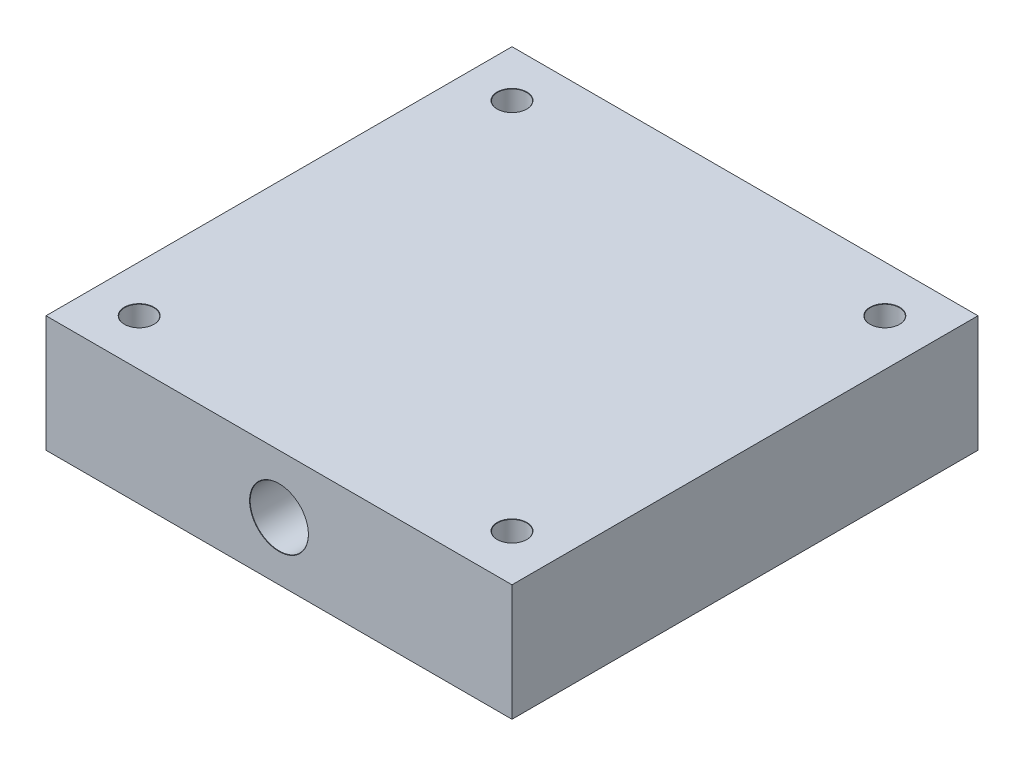
ISO-10303-21;
HEADER;
FILE_DESCRIPTION(('STEP AP214'),'2;1');
FILE_NAME('part.step','',(''),(''),'','','');
FILE_SCHEMA(('AUTOMOTIVE_DESIGN { 1 0 10303 214 1 1 1 1 }'));
ENDSEC;
DATA;
#1=APPLICATION_CONTEXT('core data for automotive mechanical design processes');
#2=APPLICATION_PROTOCOL_DEFINITION('international standard','automotive_design',2000,#1);
#3=PRODUCT_CONTEXT('',#1,'mechanical');
#4=PRODUCT('Part','Part','',(#3));
#5=PRODUCT_RELATED_PRODUCT_CATEGORY('part','',(#4));
#6=PRODUCT_DEFINITION_FORMATION('','',#4);
#7=PRODUCT_DEFINITION_CONTEXT('part definition',#1,'design');
#8=PRODUCT_DEFINITION('design','',#6,#7);
#9=PRODUCT_DEFINITION_SHAPE('','',#8);
#10=(LENGTH_UNIT() NAMED_UNIT(*) SI_UNIT(.MILLI.,.METRE.));
#11=(NAMED_UNIT(*) PLANE_ANGLE_UNIT() SI_UNIT($,.RADIAN.));
#12=(NAMED_UNIT(*) SI_UNIT($,.STERADIAN.) SOLID_ANGLE_UNIT());
#13=UNCERTAINTY_MEASURE_WITH_UNIT(LENGTH_MEASURE(1.E-05),#10,'distance_accuracy_value','');
#14=(GEOMETRIC_REPRESENTATION_CONTEXT(3) GLOBAL_UNCERTAINTY_ASSIGNED_CONTEXT((#13)) GLOBAL_UNIT_ASSIGNED_CONTEXT((#10,
#11,#12)) REPRESENTATION_CONTEXT('',''));
#15=CARTESIAN_POINT('',(0.,0.,0.));
#16=DIRECTION('',(0.,0.,1.));
#17=DIRECTION('',(1.,0.,0.));
#18=AXIS2_PLACEMENT_3D('',#15,#16,#17);
#19=CARTESIAN_POINT('',(0.,10.,0.));
#20=DIRECTION('',(1.,0.,0.));
#21=DIRECTION('',(0.,0.,-1.));
#22=AXIS2_PLACEMENT_3D('',#19,#20,#21);
#23=PLANE('',#22);
#24=DIRECTION('',(0.,0.,1.));
#25=VECTOR('',#24,1.);
#26=CARTESIAN_POINT('',(0.,0.,0.));
#27=LINE('',#26,#25);
#28=CARTESIAN_POINT('',(0.,0.,-40.));
#29=VERTEX_POINT('',#28);
#30=CARTESIAN_POINT('',(0.,0.,0.));
#31=VERTEX_POINT('',#30);
#32=EDGE_CURVE('E102',#29,#31,#27,.T.);
#33=ORIENTED_EDGE('',*,*,#32,.T.);
#34=DIRECTION('',(0.,-1.,0.));
#35=VECTOR('',#34,1.);
#36=CARTESIAN_POINT('',(0.,10.,0.));
#37=LINE('',#36,#35);
#38=CARTESIAN_POINT('',(0.,10.,0.));
#39=VERTEX_POINT('',#38);
#40=EDGE_CURVE('E11',#39,#31,#37,.T.);
#41=ORIENTED_EDGE('',*,*,#40,.F.);
#42=DIRECTION('',(0.,0.,1.));
#43=VECTOR('',#42,1.);
#44=CARTESIAN_POINT('',(0.,10.,0.));
#45=LINE('',#44,#43);
#46=CARTESIAN_POINT('',(0.,10.,-40.));
#47=VERTEX_POINT('',#46);
#48=EDGE_CURVE('E89',#47,#39,#45,.T.);
#49=ORIENTED_EDGE('',*,*,#48,.F.);
#50=DIRECTION('',(0.,-1.,0.));
#51=VECTOR('',#50,1.);
#52=CARTESIAN_POINT('',(0.,10.,-40.));
#53=LINE('',#52,#51);
#54=EDGE_CURVE('E98',#47,#29,#53,.T.);
#55=ORIENTED_EDGE('',*,*,#54,.T.);
#56=EDGE_LOOP('',(#33,#41,#49,#55));
#57=FACE_BOUND('',#56,.T.);
#58=ADVANCED_FACE('F32',(#57),#23,.F.);
#59=CARTESIAN_POINT('',(0.,10.,0.));
#60=DIRECTION('',(0.,0.,-1.));
#61=DIRECTION('',(-1.,0.,0.));
#62=AXIS2_PLACEMENT_3D('',#59,#60,#61);
#63=PLANE('',#62);
#64=CARTESIAN_POINT('',(20.,5.,0.));
#65=DIRECTION('',(0.,0.,1.));
#66=DIRECTION('',(1.,0.,0.));
#67=AXIS2_PLACEMENT_3D('',#64,#65,#66);
#68=CIRCLE('',#67,2.525);
#69=CARTESIAN_POINT('',(22.525,5.,0.));
#70=VERTEX_POINT('',#69);
#71=EDGE_CURVE('E115',#70,#70,#68,.T.);
#72=ORIENTED_EDGE('',*,*,#71,.F.);
#73=EDGE_LOOP('',(#72));
#74=FACE_BOUND('',#73,.T.);
#75=DIRECTION('',(1.,0.,0.));
#76=VECTOR('',#75,1.);
#77=CARTESIAN_POINT('',(0.,0.,0.));
#78=LINE('',#77,#76);
#79=CARTESIAN_POINT('',(40.,0.,0.));
#80=VERTEX_POINT('',#79);
#81=EDGE_CURVE('E93',#31,#80,#78,.T.);
#82=ORIENTED_EDGE('',*,*,#81,.T.);
#83=DIRECTION('',(0.,-1.,0.));
#84=VECTOR('',#83,1.);
#85=CARTESIAN_POINT('',(40.,10.,0.));
#86=LINE('',#85,#84);
#87=CARTESIAN_POINT('',(40.,10.,0.));
#88=VERTEX_POINT('',#87);
#89=EDGE_CURVE('E45',#88,#80,#86,.T.);
#90=ORIENTED_EDGE('',*,*,#89,.F.);
#91=DIRECTION('',(1.,0.,0.));
#92=VECTOR('',#91,1.);
#93=CARTESIAN_POINT('',(0.,10.,0.));
#94=LINE('',#93,#92);
#95=EDGE_CURVE('E84',#39,#88,#94,.T.);
#96=ORIENTED_EDGE('',*,*,#95,.F.);
#97=ORIENTED_EDGE('',*,*,#40,.T.);
#98=EDGE_LOOP('',(#82,#90,#96,#97));
#99=FACE_BOUND('',#98,.T.);
#100=ADVANCED_FACE('F92',(#74,#99),#63,.F.);
#101=CARTESIAN_POINT('',(40.,10.,0.));
#102=DIRECTION('',(-1.,0.,0.));
#103=DIRECTION('',(0.,0.,1.));
#104=AXIS2_PLACEMENT_3D('',#101,#102,#103);
#105=PLANE('',#104);
#106=DIRECTION('',(0.,0.,-1.));
#107=VECTOR('',#106,1.);
#108=CARTESIAN_POINT('',(40.,0.,0.));
#109=LINE('',#108,#107);
#110=CARTESIAN_POINT('',(40.,0.,-40.));
#111=VERTEX_POINT('',#110);
#112=EDGE_CURVE('E71',#80,#111,#109,.T.);
#113=ORIENTED_EDGE('',*,*,#112,.T.);
#114=DIRECTION('',(0.,-1.,0.));
#115=VECTOR('',#114,1.);
#116=CARTESIAN_POINT('',(40.,10.,-40.));
#117=LINE('',#116,#115);
#118=CARTESIAN_POINT('',(40.,10.,-40.));
#119=VERTEX_POINT('',#118);
#120=EDGE_CURVE('E94',#119,#111,#117,.T.);
#121=ORIENTED_EDGE('',*,*,#120,.F.);
#122=DIRECTION('',(0.,0.,-1.));
#123=VECTOR('',#122,1.);
#124=CARTESIAN_POINT('',(40.,10.,0.));
#125=LINE('',#124,#123);
#126=EDGE_CURVE('E87',#88,#119,#125,.T.);
#127=ORIENTED_EDGE('',*,*,#126,.F.);
#128=ORIENTED_EDGE('',*,*,#89,.T.);
#129=EDGE_LOOP('',(#113,#121,#127,#128));
#130=FACE_BOUND('',#129,.T.);
#131=ADVANCED_FACE('F96',(#130),#105,.F.);
#132=CARTESIAN_POINT('',(0.,10.,-40.));
#133=DIRECTION('',(0.,0.,1.));
#134=DIRECTION('',(1.,0.,0.));
#135=AXIS2_PLACEMENT_3D('',#132,#133,#134);
#136=PLANE('',#135);
#137=CARTESIAN_POINT('',(20.,5.,-40.));
#138=DIRECTION('',(0.,0.,-1.));
#139=DIRECTION('',(-1.,0.,0.));
#140=AXIS2_PLACEMENT_3D('',#137,#138,#139);
#141=CIRCLE('',#140,3.);
#142=CARTESIAN_POINT('',(17.,5.,-40.));
#143=VERTEX_POINT('',#142);
#144=EDGE_CURVE('E123',#143,#143,#141,.T.);
#145=ORIENTED_EDGE('',*,*,#144,.F.);
#146=EDGE_LOOP('',(#145));
#147=FACE_BOUND('',#146,.T.);
#148=DIRECTION('',(-1.,0.,0.));
#149=VECTOR('',#148,1.);
#150=CARTESIAN_POINT('',(0.,0.,-40.));
#151=LINE('',#150,#149);
#152=EDGE_CURVE('E77',#111,#29,#151,.T.);
#153=ORIENTED_EDGE('',*,*,#152,.T.);
#154=ORIENTED_EDGE('',*,*,#54,.F.);
#155=DIRECTION('',(-1.,0.,0.));
#156=VECTOR('',#155,1.);
#157=CARTESIAN_POINT('',(0.,10.,-40.));
#158=LINE('',#157,#156);
#159=EDGE_CURVE('E54',#119,#47,#158,.T.);
#160=ORIENTED_EDGE('',*,*,#159,.F.);
#161=ORIENTED_EDGE('',*,*,#120,.T.);
#162=EDGE_LOOP('',(#153,#154,#160,#161));
#163=FACE_BOUND('',#162,.T.);
#164=ADVANCED_FACE('F159',(#147,#163),#136,.F.);
#165=CARTESIAN_POINT('',(0.,10.,0.));
#166=DIRECTION('',(0.,-1.,0.));
#167=DIRECTION('',(0.,0.,-1.));
#168=AXIS2_PLACEMENT_3D('',#165,#166,#167);
#169=PLANE('',#168);
#170=CARTESIAN_POINT('',(4.,10.,-4.));
#171=DIRECTION('',(0.,-1.,0.));
#172=DIRECTION('',(0.,0.,-1.));
#173=AXIS2_PLACEMENT_3D('',#170,#171,#172);
#174=CIRCLE('',#173,1.275);
#175=CARTESIAN_POINT('',(4.,10.,-5.27499999999999));
#176=VERTEX_POINT('',#175);
#177=EDGE_CURVE('E252',#176,#176,#174,.T.);
#178=ORIENTED_EDGE('',*,*,#177,.T.);
#179=EDGE_LOOP('',(#178));
#180=FACE_BOUND('',#179,.T.);
#181=CARTESIAN_POINT('',(36.,10.,-4.));
#182=DIRECTION('',(0.,-1.,0.));
#183=DIRECTION('',(0.,0.,-1.));
#184=AXIS2_PLACEMENT_3D('',#181,#182,#183);
#185=CIRCLE('',#184,1.275);
#186=CARTESIAN_POINT('',(36.,10.,-5.275));
#187=VERTEX_POINT('',#186);
#188=EDGE_CURVE('E264',#187,#187,#185,.T.);
#189=ORIENTED_EDGE('',*,*,#188,.T.);
#190=EDGE_LOOP('',(#189));
#191=FACE_BOUND('',#190,.T.);
#192=CARTESIAN_POINT('',(36.,10.,-36.));
#193=DIRECTION('',(0.,-1.,0.));
#194=DIRECTION('',(0.,0.,-1.));
#195=AXIS2_PLACEMENT_3D('',#192,#193,#194);
#196=CIRCLE('',#195,1.275);
#197=CARTESIAN_POINT('',(36.,10.,-37.275));
#198=VERTEX_POINT('',#197);
#199=EDGE_CURVE('E276',#198,#198,#196,.T.);
#200=ORIENTED_EDGE('',*,*,#199,.T.);
#201=EDGE_LOOP('',(#200));
#202=FACE_BOUND('',#201,.T.);
#203=CARTESIAN_POINT('',(4.,10.,-36.));
#204=DIRECTION('',(0.,-1.,0.));
#205=DIRECTION('',(0.,0.,-1.));
#206=AXIS2_PLACEMENT_3D('',#203,#204,#205);
#207=CIRCLE('',#206,1.275);
#208=CARTESIAN_POINT('',(4.,10.,-37.275));
#209=VERTEX_POINT('',#208);
#210=EDGE_CURVE('E288',#209,#209,#207,.T.);
#211=ORIENTED_EDGE('',*,*,#210,.T.);
#212=EDGE_LOOP('',(#211));
#213=FACE_BOUND('',#212,.T.);
#214=ORIENTED_EDGE('',*,*,#48,.T.);
#215=ORIENTED_EDGE('',*,*,#95,.T.);
#216=ORIENTED_EDGE('',*,*,#126,.T.);
#217=ORIENTED_EDGE('',*,*,#159,.T.);
#218=EDGE_LOOP('',(#214,#215,#216,#217));
#219=FACE_BOUND('',#218,.T.);
#220=ADVANCED_FACE('F85',(#180,#191,#202,#213,#219),#169,.F.);
#221=CARTESIAN_POINT('',(0.,0.,0.));
#222=DIRECTION('',(0.,-1.,0.));
#223=DIRECTION('',(0.,0.,-1.));
#224=AXIS2_PLACEMENT_3D('',#221,#222,#223);
#225=PLANE('',#224);
#226=CARTESIAN_POINT('',(20.,0.,-36.));
#227=DIRECTION('',(0.,-1.,0.));
#228=DIRECTION('',(0.,0.,-1.));
#229=AXIS2_PLACEMENT_3D('',#226,#227,#228);
#230=CIRCLE('',#229,1.275);
#231=CARTESIAN_POINT('',(20.,0.,-37.275));
#232=VERTEX_POINT('',#231);
#233=EDGE_CURVE('E248',#232,#232,#230,.T.);
#234=ORIENTED_EDGE('',*,*,#233,.F.);
#235=EDGE_LOOP('',(#234));
#236=FACE_BOUND('',#235,.T.);
#237=CARTESIAN_POINT('',(4.,0.,-4.));
#238=DIRECTION('',(0.,-1.,0.));
#239=DIRECTION('',(0.,0.,-1.));
#240=AXIS2_PLACEMENT_3D('',#237,#238,#239);
#241=CIRCLE('',#240,1.275);
#242=CARTESIAN_POINT('',(4.,0.,-5.275));
#243=VERTEX_POINT('',#242);
#244=EDGE_CURVE('E255',#243,#243,#241,.T.);
#245=ORIENTED_EDGE('',*,*,#244,.F.);
#246=EDGE_LOOP('',(#245));
#247=FACE_BOUND('',#246,.T.);
#248=CARTESIAN_POINT('',(36.,0.,-4.));
#249=DIRECTION('',(0.,-1.,0.));
#250=DIRECTION('',(0.,0.,-1.));
#251=AXIS2_PLACEMENT_3D('',#248,#249,#250);
#252=CIRCLE('',#251,1.275);
#253=CARTESIAN_POINT('',(36.,0.,-5.275));
#254=VERTEX_POINT('',#253);
#255=EDGE_CURVE('E267',#254,#254,#252,.T.);
#256=ORIENTED_EDGE('',*,*,#255,.F.);
#257=EDGE_LOOP('',(#256));
#258=FACE_BOUND('',#257,.T.);
#259=CARTESIAN_POINT('',(36.,0.,-36.));
#260=DIRECTION('',(0.,-1.,0.));
#261=DIRECTION('',(0.,0.,-1.));
#262=AXIS2_PLACEMENT_3D('',#259,#260,#261);
#263=CIRCLE('',#262,1.275);
#264=CARTESIAN_POINT('',(36.,0.,-37.275));
#265=VERTEX_POINT('',#264);
#266=EDGE_CURVE('E279',#265,#265,#263,.T.);
#267=ORIENTED_EDGE('',*,*,#266,.F.);
#268=EDGE_LOOP('',(#267));
#269=FACE_BOUND('',#268,.T.);
#270=CARTESIAN_POINT('',(4.,0.,-36.));
#271=DIRECTION('',(0.,-1.,0.));
#272=DIRECTION('',(0.,0.,-1.));
#273=AXIS2_PLACEMENT_3D('',#270,#271,#272);
#274=CIRCLE('',#273,1.275);
#275=CARTESIAN_POINT('',(4.,0.,-37.275));
#276=VERTEX_POINT('',#275);
#277=EDGE_CURVE('E291',#276,#276,#274,.T.);
#278=ORIENTED_EDGE('',*,*,#277,.F.);
#279=EDGE_LOOP('',(#278));
#280=FACE_BOUND('',#279,.T.);
#281=ORIENTED_EDGE('',*,*,#32,.F.);
#282=ORIENTED_EDGE('',*,*,#152,.F.);
#283=ORIENTED_EDGE('',*,*,#112,.F.);
#284=ORIENTED_EDGE('',*,*,#81,.F.);
#285=EDGE_LOOP('',(#281,#282,#283,#284));
#286=FACE_BOUND('',#285,.T.);
#287=ADVANCED_FACE('F167',(#236,#247,#258,#269,#280,#286),#225,.T.);
#288=CARTESIAN_POINT('',(20.,5.,0.));
#289=DIRECTION('',(0.,0.,1.));
#290=DIRECTION('',(1.,0.,0.));
#291=AXIS2_PLACEMENT_3D('',#288,#289,#290);
#292=CYLINDRICAL_SURFACE('',#291,1.99999999999999);
#293=CARTESIAN_POINT('',(20.,5.,-19.3991393809724));
#294=DIRECTION('',(0.,0.,-1.));
#295=DIRECTION('',(-1.,0.,0.));
#296=AXIS2_PLACEMENT_3D('',#293,#294,#295);
#297=CIRCLE('',#296,1.99999999999999);
#298=CARTESIAN_POINT('',(18.,5.,-19.3991393809724));
#299=VERTEX_POINT('',#298);
#300=EDGE_CURVE('E113',#299,#299,#297,.T.);
#301=ORIENTED_EDGE('',*,*,#300,.T.);
#302=EDGE_LOOP('',(#301));
#303=FACE_BOUND('',#302,.T.);
#304=CARTESIAN_POINT('',(20.,5.,-8.30043030951378));
#305=DIRECTION('',(0.,0.,1.));
#306=DIRECTION('',(1.,0.,0.));
#307=AXIS2_PLACEMENT_3D('',#304,#305,#306);
#308=CIRCLE('',#307,1.99999999999999);
#309=CARTESIAN_POINT('',(22.,5.,-8.30043030951378));
#310=VERTEX_POINT('',#309);
#311=EDGE_CURVE('E105',#310,#310,#308,.T.);
#312=ORIENTED_EDGE('',*,*,#311,.T.);
#313=EDGE_LOOP('',(#312));
#314=FACE_BOUND('',#313,.T.);
#315=ADVANCED_FACE('F170',(#303,#314),#292,.F.);
#316=CARTESIAN_POINT('',(20.,5.,-7.99999999999999));
#317=DIRECTION('',(0.,0.,1.));
#318=DIRECTION('',(1.,0.,0.));
#319=AXIS2_PLACEMENT_3D('',#316,#317,#318);
#320=CONICAL_SURFACE('',#319,2.49999999999999,1.02974425867665);
#321=CARTESIAN_POINT('',(20.,5.,-7.99999999999999));
#322=DIRECTION('',(0.,0.,1.));
#323=DIRECTION('',(1.,0.,0.));
#324=AXIS2_PLACEMENT_3D('',#321,#322,#323);
#325=CIRCLE('',#324,2.49999999999999);
#326=CARTESIAN_POINT('',(22.5,5.,-7.99999999999999));
#327=VERTEX_POINT('',#326);
#328=EDGE_CURVE('E112',#327,#327,#325,.T.);
#329=ORIENTED_EDGE('',*,*,#328,.T.);
#330=EDGE_LOOP('',(#329));
#331=FACE_BOUND('',#330,.T.);
#332=ORIENTED_EDGE('',*,*,#311,.F.);
#333=EDGE_LOOP('',(#332));
#334=FACE_BOUND('',#333,.T.);
#335=ADVANCED_FACE('F137',(#331,#334),#320,.F.);
#336=CARTESIAN_POINT('',(20.,5.,0.));
#337=DIRECTION('',(0.,0.,1.));
#338=DIRECTION('',(1.,0.,0.));
#339=AXIS2_PLACEMENT_3D('',#336,#337,#338);
#340=CYLINDRICAL_SURFACE('',#339,2.49999999999999);
#341=ORIENTED_EDGE('',*,*,#328,.F.);
#342=EDGE_LOOP('',(#341));
#343=FACE_BOUND('',#342,.T.);
#344=CARTESIAN_POINT('',(20.,5.,-0.0250000000000007));
#345=DIRECTION('',(0.,0.,1.));
#346=DIRECTION('',(1.,0.,0.));
#347=AXIS2_PLACEMENT_3D('',#344,#345,#346);
#348=CIRCLE('',#347,2.5);
#349=CARTESIAN_POINT('',(22.5,5.,-0.0250000000000007));
#350=VERTEX_POINT('',#349);
#351=EDGE_CURVE('E120',#350,#350,#348,.T.);
#352=ORIENTED_EDGE('',*,*,#351,.T.);
#353=EDGE_LOOP('',(#352));
#354=FACE_BOUND('',#353,.T.);
#355=ADVANCED_FACE('F140',(#343,#354),#340,.F.);
#356=CARTESIAN_POINT('',(20.,5.,0.));
#357=DIRECTION('',(0.,0.,1.));
#358=DIRECTION('',(1.,0.,0.));
#359=AXIS2_PLACEMENT_3D('',#356,#357,#358);
#360=CONICAL_SURFACE('',#359,2.525,0.785398163397414);
#361=ORIENTED_EDGE('',*,*,#351,.F.);
#362=EDGE_LOOP('',(#361));
#363=FACE_BOUND('',#362,.T.);
#364=ORIENTED_EDGE('',*,*,#71,.T.);
#365=EDGE_LOOP('',(#364));
#366=FACE_BOUND('',#365,.T.);
#367=ADVANCED_FACE('F143',(#363,#366),#360,.F.);
#368=CARTESIAN_POINT('',(20.,5.,-20.));
#369=DIRECTION('',(0.,0.,-1.));
#370=DIRECTION('',(-1.,0.,0.));
#371=AXIS2_PLACEMENT_3D('',#368,#369,#370);
#372=CONICAL_SURFACE('',#371,3.,1.02974425867665);
#373=CARTESIAN_POINT('',(20.,5.,-20.));
#374=DIRECTION('',(0.,0.,-1.));
#375=DIRECTION('',(-1.,0.,0.));
#376=AXIS2_PLACEMENT_3D('',#373,#374,#375);
#377=CIRCLE('',#376,3.);
#378=CARTESIAN_POINT('',(17.,5.,-20.));
#379=VERTEX_POINT('',#378);
#380=EDGE_CURVE('E116',#379,#379,#377,.T.);
#381=ORIENTED_EDGE('',*,*,#380,.T.);
#382=EDGE_LOOP('',(#381));
#383=FACE_BOUND('',#382,.T.);
#384=ORIENTED_EDGE('',*,*,#300,.F.);
#385=EDGE_LOOP('',(#384));
#386=FACE_BOUND('',#385,.T.);
#387=ADVANCED_FACE('F149',(#383,#386),#372,.F.);
#388=CARTESIAN_POINT('',(20.,5.,-40.));
#389=DIRECTION('',(0.,0.,-1.));
#390=DIRECTION('',(-1.,0.,0.));
#391=AXIS2_PLACEMENT_3D('',#388,#389,#390);
#392=CYLINDRICAL_SURFACE('',#391,3.);
#393=CARTESIAN_POINT('',(20.,2.,-37.25));
#394=CARTESIAN_POINT('',(20.0669580526363,2.00000541632728,-37.2499927949087));
#395=CARTESIAN_POINT('',(20.1340213970638,2.0022676702529,-37.2445880414719));
#396=CARTESIAN_POINT('',(20.2662473711563,2.01109846420449,-37.2231609350798));
#397=CARTESIAN_POINT('',(20.3314045764236,2.01767824098973,-37.2071108755357));
#398=CARTESIAN_POINT('',(20.4576887336531,2.03443710961873,-37.1650889082194));
#399=CARTESIAN_POINT('',(20.5188285244263,2.04460400024997,-37.1391506105318));
#400=CARTESIAN_POINT('',(20.6358297566798,2.06754713529336,-37.0782271767674));
#401=CARTESIAN_POINT('',(20.6916927900159,2.08032258907151,-37.0432447810291));
#402=CARTESIAN_POINT('',(20.7994484035595,2.10792171648132,-36.9633710174091));
#403=CARTESIAN_POINT('',(20.8510412675178,2.12281246673908,-36.9180986912102));
#404=CARTESIAN_POINT('',(20.9461598210913,2.15267285931487,-36.8197356652174));
#405=CARTESIAN_POINT('',(20.9896812631531,2.16764253893191,-36.7666408751055));
#406=CARTESIAN_POINT('',(21.0695373769707,2.19678978187005,-36.6509732224351));
#407=CARTESIAN_POINT('',(21.1054130815393,2.21089213126616,-36.5880625515735));
#408=CARTESIAN_POINT('',(21.1659394058887,2.23564427642995,-36.4564267420791));
#409=CARTESIAN_POINT('',(21.1905958083629,2.24629584999177,-36.3877046205155));
#410=CARTESIAN_POINT('',(21.2267459831216,2.26221444612295,-36.2498463082321));
#411=CARTESIAN_POINT('',(21.2388165787761,2.26771612348213,-36.1808895166079));
#412=CARTESIAN_POINT('',(21.251252099678,2.27338673780496,-36.0417267073134));
#413=CARTESIAN_POINT('',(21.251623480544,2.27355861574741,-35.9715213999743));
#414=CARTESIAN_POINT('',(21.2410845036367,2.26874880439148,-35.8375999395651));
#415=CARTESIAN_POINT('',(21.231036811123,2.26416117276378,-35.7737989034355));
#416=CARTESIAN_POINT('',(21.2013919101578,2.25101517226204,-35.6488879089996));
#417=CARTESIAN_POINT('',(21.1817928728718,2.24245604296437,-35.5877784685082));
#418=CARTESIAN_POINT('',(21.1332195872757,2.22213815227244,-35.4684422970086));
#419=CARTESIAN_POINT('',(21.1040547153924,2.21031518050864,-35.4103045790866));
#420=CARTESIAN_POINT('',(21.0373124258056,2.18481668858914,-35.2995222661199));
#421=CARTESIAN_POINT('',(20.9997316905195,2.17114043870221,-35.2468798493865));
#422=CARTESIAN_POINT('',(20.9134959655438,2.14207023122021,-35.1439000412672));
#423=CARTESIAN_POINT('',(20.8641734832075,2.12662878595528,-35.0941334326146));
#424=CARTESIAN_POINT('',(20.7577295910515,2.09674326887471,-35.0033864970408));
#425=CARTESIAN_POINT('',(20.7006063594485,2.0822994312299,-34.9624082283078));
#426=CARTESIAN_POINT('',(20.5784479486934,2.05561716443527,-34.8895641763837));
#427=CARTESIAN_POINT('',(20.5132605824477,2.04343733456667,-34.8579305548493));
#428=CARTESIAN_POINT('',(20.3778524025268,2.02310518585197,-34.8062788603968));
#429=CARTESIAN_POINT('',(20.307634394795,2.014950641542,-34.7862543680562));
#430=CARTESIAN_POINT('',(20.1689281133462,2.00400358813615,-34.7595840078734));
#431=CARTESIAN_POINT('',(20.1006112852786,2.00090458952875,-34.7521721425563));
#432=CARTESIAN_POINT('',(19.9636453445039,1.99943949631256,-34.7486537763859));
#433=CARTESIAN_POINT('',(19.8949963328474,2.00107204288061,-34.752544029748));
#434=CARTESIAN_POINT('',(19.7629017576586,2.0086878234306,-34.7709710848061));
#435=CARTESIAN_POINT('',(19.6993670333606,2.01445112716011,-34.7849699540972));
#436=CARTESIAN_POINT('',(19.5756172510289,2.02951393227586,-34.8224681945408));
#437=CARTESIAN_POINT('',(19.5154026134816,2.03881388040297,-34.8459687659503));
#438=CARTESIAN_POINT('',(19.3978910001309,2.06041729354835,-34.9025709757121));
#439=CARTESIAN_POINT('',(19.3407427631447,2.07280508530719,-34.935948183146));
#440=CARTESIAN_POINT('',(19.2326537837686,2.0992619542091,-35.0110533777917));
#441=CARTESIAN_POINT('',(19.1817156473981,2.11333173231267,-35.0527848515293));
#442=CARTESIAN_POINT('',(19.0836665697257,2.14287912104563,-35.1469032332724));
#443=CARTESIAN_POINT('',(19.0370893020202,2.15838548408971,-35.1998385029863));
#444=CARTESIAN_POINT('',(18.9533301538945,2.18815663231995,-35.3130212759354));
#445=CARTESIAN_POINT('',(18.9161504071438,2.20242113506562,-35.3732704351717));
#446=CARTESIAN_POINT('',(18.851840397913,2.22818613756012,-35.5006141753026));
#447=CARTESIAN_POINT('',(18.8248608176267,2.23964437444889,-35.5677940355148));
#448=CARTESIAN_POINT('',(18.7828258604843,2.25791644341043,-35.7063705938101));
#449=CARTESIAN_POINT('',(18.7677606513631,2.26473410444248,-35.7777637624834));
#450=CARTESIAN_POINT('',(18.750959196511,2.27236835462736,-35.9168186991992));
#451=CARTESIAN_POINT('',(18.7482861958687,2.27360649032838,-35.9843446622926));
#452=CARTESIAN_POINT('',(18.7538442447609,2.27106146988976,-36.1188428611411));
#453=CARTESIAN_POINT('',(18.7620736203528,2.26727908459694,-36.1858151803137));
#454=CARTESIAN_POINT('',(18.7884159521951,2.25550448697732,-36.3140927474689));
#455=CARTESIAN_POINT('',(18.8060509642853,2.2477164515352,-36.3755166734634));
#456=CARTESIAN_POINT('',(18.8502367179787,2.22896818800811,-36.4945480213572));
#457=CARTESIAN_POINT('',(18.8767899648275,2.21800706868307,-36.5521543653988));
#458=CARTESIAN_POINT('',(18.9398971406451,2.19333045439987,-36.6656958959491));
#459=CARTESIAN_POINT('',(18.9769563908952,2.17948897286321,-36.7213223301683));
#460=CARTESIAN_POINT('',(19.0593159273696,2.15096310946161,-36.8258601393607));
#461=CARTESIAN_POINT('',(19.1046190710944,2.13627843654125,-36.8747691756006));
#462=CARTESIAN_POINT('',(19.2060979542212,2.10643607149894,-36.9681486816848));
#463=CARTESIAN_POINT('',(19.262825260051,2.09132182488209,-37.0120364328407));
#464=CARTESIAN_POINT('',(19.3833999207468,2.0633985637798,-37.0896994535436));
#465=CARTESIAN_POINT('',(19.4472505020543,2.0505906008326,-37.1234701148896));
#466=CARTESIAN_POINT('',(19.5792679432821,2.02890816637539,-37.1792098454399));
#467=CARTESIAN_POINT('',(19.6473460090194,2.01997217418036,-37.2013647666173));
#468=CARTESIAN_POINT('',(19.7865895781534,2.00678990231376,-37.2337063290778));
#469=CARTESIAN_POINT('',(19.857744683019,2.00252894188034,-37.2439304425299));
#470=CARTESIAN_POINT('',(19.9527639180808,2.00027712431067,-37.2493331610865));
#471=CARTESIAN_POINT('',(19.9763754053243,1.99999808897465,-37.2500025421492));
#472=CARTESIAN_POINT('',(20.,2.,-37.25));
#473=B_SPLINE_CURVE_WITH_KNOTS('',3,(#393,#394,#395,#396,#397,#398,#399,#400,#401,#402,#403,
#404,#405,#406,#407,#408,#409,#410,#411,#412,#413,#414,#415,#416,#417,#418,#419,#420,#421,#422,
#423,#424,#425,#426,#427,#428,#429,#430,#431,#432,#433,#434,#435,#436,#437,#438,#439,#440,#441,
#442,#443,#444,#445,#446,#447,#448,#449,#450,#451,#452,#453,#454,#455,#456,#457,#458,#459,#460,
#461,#462,#463,#464,#465,#466,#467,#468,#469,#470,#471,#472),.UNSPECIFIED.,.T.,.F.,(4,2,2,2,2,2,
2,2,2,2,2,2,2,2,2,2,2,2,2,2,2,2,2,2,2,2,2,2,2,2,2,2,2,2,2,2,2,2,2,4),(0.,0.200806918883943,
0.402138540628699,0.602791851906306,0.80338443685298,1.01317936288808,1.22308438131466,
1.44331724539126,1.66343646730588,1.87295273137557,2.08235338249046,2.27570157202557,
2.46908679727213,2.66658713058714,2.86416545717206,3.07844141127896,3.29276749314588,
3.51204055060813,3.73119224218297,3.9364844339325,4.14171767493171,4.33676589735721,
4.53183876601785,4.73297135272161,4.93418805469496,5.14978488029294,5.3654306124034,
5.58414788359522,5.8026844707458,6.00439877559643,6.20608211297536,6.39837649964761,
6.59072494950612,6.79463893397441,6.99862373425944,7.21746535004889,7.43640649428583,
7.65172855819385,7.86637250469321,7.93722256499097),.UNSPECIFIED.);
#474=CARTESIAN_POINT('',(20.,2.,-37.25));
#475=VERTEX_POINT('',#474);
#476=EDGE_CURVE('E35',#475,#475,#473,.T.);
#477=ORIENTED_EDGE('',*,*,#476,.T.);
#478=EDGE_LOOP('',(#477));
#479=FACE_BOUND('',#478,.T.);
#480=ORIENTED_EDGE('',*,*,#380,.F.);
#481=EDGE_LOOP('',(#480));
#482=FACE_BOUND('',#481,.T.);
#483=ORIENTED_EDGE('',*,*,#144,.T.);
#484=EDGE_LOOP('',(#483));
#485=FACE_BOUND('',#484,.T.);
#486=ADVANCED_FACE('F180',(#479,#482,#485),#392,.F.);
#487=CARTESIAN_POINT('',(4.,9.975,-36.));
#488=DIRECTION('',(0.,1.,0.));
#489=DIRECTION('',(0.,0.,1.));
#490=AXIS2_PLACEMENT_3D('',#487,#488,#489);
#491=CONICAL_SURFACE('',#490,1.25,0.785398163397483);
#492=ORIENTED_EDGE('',*,*,#210,.F.);
#493=EDGE_LOOP('',(#492));
#494=FACE_BOUND('',#493,.T.);
#495=CARTESIAN_POINT('',(4.,9.975,-36.));
#496=DIRECTION('',(0.,-1.,0.));
#497=DIRECTION('',(0.,0.,-1.));
#498=AXIS2_PLACEMENT_3D('',#495,#496,#497);
#499=CIRCLE('',#498,1.25);
#500=CARTESIAN_POINT('',(4.,9.975,-37.25));
#501=VERTEX_POINT('',#500);
#502=EDGE_CURVE('E128',#501,#501,#499,.T.);
#503=ORIENTED_EDGE('',*,*,#502,.T.);
#504=EDGE_LOOP('',(#503));
#505=FACE_BOUND('',#504,.T.);
#506=ADVANCED_FACE('F184',(#494,#505),#491,.F.);
#507=CARTESIAN_POINT('',(4.,0.,-36.));
#508=DIRECTION('',(0.,-1.,0.));
#509=DIRECTION('',(0.,0.,-1.));
#510=AXIS2_PLACEMENT_3D('',#507,#508,#509);
#511=CYLINDRICAL_SURFACE('',#510,1.25);
#512=ORIENTED_EDGE('',*,*,#502,.F.);
#513=EDGE_LOOP('',(#512));
#514=FACE_BOUND('',#513,.T.);
#515=CARTESIAN_POINT('',(4.,0.0250000000000025,-36.));
#516=DIRECTION('',(0.,-1.,0.));
#517=DIRECTION('',(0.,0.,-1.));
#518=AXIS2_PLACEMENT_3D('',#515,#516,#517);
#519=CIRCLE('',#518,1.25);
#520=CARTESIAN_POINT('',(4.,0.0250000000000025,-37.25));
#521=VERTEX_POINT('',#520);
#522=EDGE_CURVE('E294',#521,#521,#519,.T.);
#523=ORIENTED_EDGE('',*,*,#522,.T.);
#524=EDGE_LOOP('',(#523));
#525=FACE_BOUND('',#524,.T.);
#526=ADVANCED_FACE('F188',(#514,#525),#511,.F.);
#527=CARTESIAN_POINT('',(4.,0.,-36.));
#528=DIRECTION('',(0.,-1.,0.));
#529=DIRECTION('',(0.,0.,-1.));
#530=AXIS2_PLACEMENT_3D('',#527,#528,#529);
#531=CONICAL_SURFACE('',#530,1.275,0.785398163397396);
#532=ORIENTED_EDGE('',*,*,#522,.F.);
#533=EDGE_LOOP('',(#532));
#534=FACE_BOUND('',#533,.T.);
#535=ORIENTED_EDGE('',*,*,#277,.T.);
#536=EDGE_LOOP('',(#535));
#537=FACE_BOUND('',#536,.T.);
#538=ADVANCED_FACE('F192',(#534,#537),#531,.F.);
#539=CARTESIAN_POINT('',(36.,9.975,-36.));
#540=DIRECTION('',(0.,1.,0.));
#541=DIRECTION('',(0.,0.,1.));
#542=AXIS2_PLACEMENT_3D('',#539,#540,#541);
#543=CONICAL_SURFACE('',#542,1.24999999999999,0.785398163397552);
#544=ORIENTED_EDGE('',*,*,#199,.F.);
#545=EDGE_LOOP('',(#544));
#546=FACE_BOUND('',#545,.T.);
#547=CARTESIAN_POINT('',(36.,9.975,-36.));
#548=DIRECTION('',(0.,-1.,0.));
#549=DIRECTION('',(0.,0.,-1.));
#550=AXIS2_PLACEMENT_3D('',#547,#548,#549);
#551=CIRCLE('',#550,1.24999999999999);
#552=CARTESIAN_POINT('',(36.,9.975,-37.25));
#553=VERTEX_POINT('',#552);
#554=EDGE_CURVE('E285',#553,#553,#551,.T.);
#555=ORIENTED_EDGE('',*,*,#554,.T.);
#556=EDGE_LOOP('',(#555));
#557=FACE_BOUND('',#556,.T.);
#558=ADVANCED_FACE('F196',(#546,#557),#543,.F.);
#559=CARTESIAN_POINT('',(36.,0.,-36.));
#560=DIRECTION('',(0.,-1.,0.));
#561=DIRECTION('',(0.,0.,-1.));
#562=AXIS2_PLACEMENT_3D('',#559,#560,#561);
#563=CYLINDRICAL_SURFACE('',#562,1.25);
#564=ORIENTED_EDGE('',*,*,#554,.F.);
#565=EDGE_LOOP('',(#564));
#566=FACE_BOUND('',#565,.T.);
#567=CARTESIAN_POINT('',(36.,0.0250000000000025,-36.));
#568=DIRECTION('',(0.,-1.,0.));
#569=DIRECTION('',(0.,0.,-1.));
#570=AXIS2_PLACEMENT_3D('',#567,#568,#569);
#571=CIRCLE('',#570,1.25);
#572=CARTESIAN_POINT('',(36.,0.0250000000000025,-37.25));
#573=VERTEX_POINT('',#572);
#574=EDGE_CURVE('E282',#573,#573,#571,.T.);
#575=ORIENTED_EDGE('',*,*,#574,.T.);
#576=EDGE_LOOP('',(#575));
#577=FACE_BOUND('',#576,.T.);
#578=ADVANCED_FACE('F200',(#566,#577),#563,.F.);
#579=CARTESIAN_POINT('',(36.,0.,-36.));
#580=DIRECTION('',(0.,-1.,0.));
#581=DIRECTION('',(0.,0.,-1.));
#582=AXIS2_PLACEMENT_3D('',#579,#580,#581);
#583=CONICAL_SURFACE('',#582,1.275,0.785398163397309);
#584=ORIENTED_EDGE('',*,*,#574,.F.);
#585=EDGE_LOOP('',(#584));
#586=FACE_BOUND('',#585,.T.);
#587=ORIENTED_EDGE('',*,*,#266,.T.);
#588=EDGE_LOOP('',(#587));
#589=FACE_BOUND('',#588,.T.);
#590=ADVANCED_FACE('F204',(#586,#589),#583,.F.);
#591=CARTESIAN_POINT('',(36.,9.975,-4.));
#592=DIRECTION('',(0.,1.,0.));
#593=DIRECTION('',(0.,0.,1.));
#594=AXIS2_PLACEMENT_3D('',#591,#592,#593);
#595=CONICAL_SURFACE('',#594,1.24999999999999,0.785398163397552);
#596=ORIENTED_EDGE('',*,*,#188,.F.);
#597=EDGE_LOOP('',(#596));
#598=FACE_BOUND('',#597,.T.);
#599=CARTESIAN_POINT('',(36.,9.975,-4.));
#600=DIRECTION('',(0.,-1.,0.));
#601=DIRECTION('',(0.,0.,-1.));
#602=AXIS2_PLACEMENT_3D('',#599,#600,#601);
#603=CIRCLE('',#602,1.24999999999999);
#604=CARTESIAN_POINT('',(36.,9.975,-5.24999999999999));
#605=VERTEX_POINT('',#604);
#606=EDGE_CURVE('E273',#605,#605,#603,.T.);
#607=ORIENTED_EDGE('',*,*,#606,.T.);
#608=EDGE_LOOP('',(#607));
#609=FACE_BOUND('',#608,.T.);
#610=ADVANCED_FACE('F208',(#598,#609),#595,.F.);
#611=CARTESIAN_POINT('',(36.,0.,-4.));
#612=DIRECTION('',(0.,-1.,0.));
#613=DIRECTION('',(0.,0.,-1.));
#614=AXIS2_PLACEMENT_3D('',#611,#612,#613);
#615=CYLINDRICAL_SURFACE('',#614,1.25);
#616=ORIENTED_EDGE('',*,*,#606,.F.);
#617=EDGE_LOOP('',(#616));
#618=FACE_BOUND('',#617,.T.);
#619=CARTESIAN_POINT('',(36.,0.0250000000000025,-4.));
#620=DIRECTION('',(0.,-1.,0.));
#621=DIRECTION('',(0.,0.,-1.));
#622=AXIS2_PLACEMENT_3D('',#619,#620,#621);
#623=CIRCLE('',#622,1.25);
#624=CARTESIAN_POINT('',(36.,0.0250000000000025,-5.25));
#625=VERTEX_POINT('',#624);
#626=EDGE_CURVE('E270',#625,#625,#623,.T.);
#627=ORIENTED_EDGE('',*,*,#626,.T.);
#628=EDGE_LOOP('',(#627));
#629=FACE_BOUND('',#628,.T.);
#630=ADVANCED_FACE('F212',(#618,#629),#615,.F.);
#631=CARTESIAN_POINT('',(36.,0.,-4.));
#632=DIRECTION('',(0.,-1.,0.));
#633=DIRECTION('',(0.,0.,-1.));
#634=AXIS2_PLACEMENT_3D('',#631,#632,#633);
#635=CONICAL_SURFACE('',#634,1.275,0.785398163397309);
#636=ORIENTED_EDGE('',*,*,#626,.F.);
#637=EDGE_LOOP('',(#636));
#638=FACE_BOUND('',#637,.T.);
#639=ORIENTED_EDGE('',*,*,#255,.T.);
#640=EDGE_LOOP('',(#639));
#641=FACE_BOUND('',#640,.T.);
#642=ADVANCED_FACE('F216',(#638,#641),#635,.F.);
#643=CARTESIAN_POINT('',(4.,9.975,-4.));
#644=DIRECTION('',(0.,1.,0.));
#645=DIRECTION('',(0.,0.,1.));
#646=AXIS2_PLACEMENT_3D('',#643,#644,#645);
#647=CONICAL_SURFACE('',#646,1.25,0.785398163397483);
#648=ORIENTED_EDGE('',*,*,#177,.F.);
#649=EDGE_LOOP('',(#648));
#650=FACE_BOUND('',#649,.T.);
#651=CARTESIAN_POINT('',(4.,9.975,-4.));
#652=DIRECTION('',(0.,-1.,0.));
#653=DIRECTION('',(0.,0.,-1.));
#654=AXIS2_PLACEMENT_3D('',#651,#652,#653);
#655=CIRCLE('',#654,1.25);
#656=CARTESIAN_POINT('',(4.,9.975,-5.24999999999999));
#657=VERTEX_POINT('',#656);
#658=EDGE_CURVE('E261',#657,#657,#655,.T.);
#659=ORIENTED_EDGE('',*,*,#658,.T.);
#660=EDGE_LOOP('',(#659));
#661=FACE_BOUND('',#660,.T.);
#662=ADVANCED_FACE('F220',(#650,#661),#647,.F.);
#663=CARTESIAN_POINT('',(4.,0.,-4.));
#664=DIRECTION('',(0.,-1.,0.));
#665=DIRECTION('',(0.,0.,-1.));
#666=AXIS2_PLACEMENT_3D('',#663,#664,#665);
#667=CYLINDRICAL_SURFACE('',#666,1.25);
#668=ORIENTED_EDGE('',*,*,#658,.F.);
#669=EDGE_LOOP('',(#668));
#670=FACE_BOUND('',#669,.T.);
#671=CARTESIAN_POINT('',(4.,0.0250000000000025,-4.));
#672=DIRECTION('',(0.,-1.,0.));
#673=DIRECTION('',(0.,0.,-1.));
#674=AXIS2_PLACEMENT_3D('',#671,#672,#673);
#675=CIRCLE('',#674,1.25);
#676=CARTESIAN_POINT('',(4.,0.0250000000000025,-5.25));
#677=VERTEX_POINT('',#676);
#678=EDGE_CURVE('E258',#677,#677,#675,.T.);
#679=ORIENTED_EDGE('',*,*,#678,.T.);
#680=EDGE_LOOP('',(#679));
#681=FACE_BOUND('',#680,.T.);
#682=ADVANCED_FACE('F224',(#670,#681),#667,.F.);
#683=CARTESIAN_POINT('',(4.,0.,-4.));
#684=DIRECTION('',(0.,-1.,0.));
#685=DIRECTION('',(0.,0.,-1.));
#686=AXIS2_PLACEMENT_3D('',#683,#684,#685);
#687=CONICAL_SURFACE('',#686,1.275,0.785398163397396);
#688=ORIENTED_EDGE('',*,*,#678,.F.);
#689=EDGE_LOOP('',(#688));
#690=FACE_BOUND('',#689,.T.);
#691=ORIENTED_EDGE('',*,*,#244,.T.);
#692=EDGE_LOOP('',(#691));
#693=FACE_BOUND('',#692,.T.);
#694=ADVANCED_FACE('F228',(#690,#693),#687,.F.);
#695=CARTESIAN_POINT('',(20.,0.,-36.));
#696=DIRECTION('',(0.,-1.,0.));
#697=DIRECTION('',(0.,0.,-1.));
#698=AXIS2_PLACEMENT_3D('',#695,#696,#697);
#699=CYLINDRICAL_SURFACE('',#698,1.25);
#700=CARTESIAN_POINT('',(20.,0.0250000000000007,-36.));
#701=DIRECTION('',(0.,-1.,0.));
#702=DIRECTION('',(0.,0.,-1.));
#703=AXIS2_PLACEMENT_3D('',#700,#701,#702);
#704=CIRCLE('',#703,1.25);
#705=CARTESIAN_POINT('',(20.,0.0250000000000007,-37.25));
#706=VERTEX_POINT('',#705);
#707=EDGE_CURVE('E245',#706,#706,#704,.T.);
#708=ORIENTED_EDGE('',*,*,#707,.T.);
#709=EDGE_LOOP('',(#708));
#710=FACE_BOUND('',#709,.T.);
#711=ORIENTED_EDGE('',*,*,#476,.F.);
#712=EDGE_LOOP('',(#711));
#713=FACE_BOUND('',#712,.T.);
#714=ADVANCED_FACE('F231',(#710,#713),#699,.F.);
#715=CARTESIAN_POINT('',(20.,0.,-36.));
#716=DIRECTION('',(0.,-1.,0.));
#717=DIRECTION('',(0.,0.,-1.));
#718=AXIS2_PLACEMENT_3D('',#715,#716,#717);
#719=CONICAL_SURFACE('',#718,1.275,0.785398163397448);
#720=ORIENTED_EDGE('',*,*,#707,.F.);
#721=EDGE_LOOP('',(#720));
#722=FACE_BOUND('',#721,.T.);
#723=ORIENTED_EDGE('',*,*,#233,.T.);
#724=EDGE_LOOP('',(#723));
#725=FACE_BOUND('',#724,.T.);
#726=ADVANCED_FACE('F236',(#722,#725),#719,.F.);
#727=CLOSED_SHELL('',(#58,#100,#131,#164,#220,#287,#315,#335,#355,#367,#387,#486,#506,#526,#538,
#558,#578,#590,#610,#630,#642,#662,#682,#694,#714,#726));
#728=MANIFOLD_SOLID_BREP('B2',#727);
#729=ADVANCED_BREP_SHAPE_REPRESENTATION('',(#18,#728),#14);
#730=SHAPE_DEFINITION_REPRESENTATION(#9,#729);
ENDSEC;
END-ISO-10303-21;
